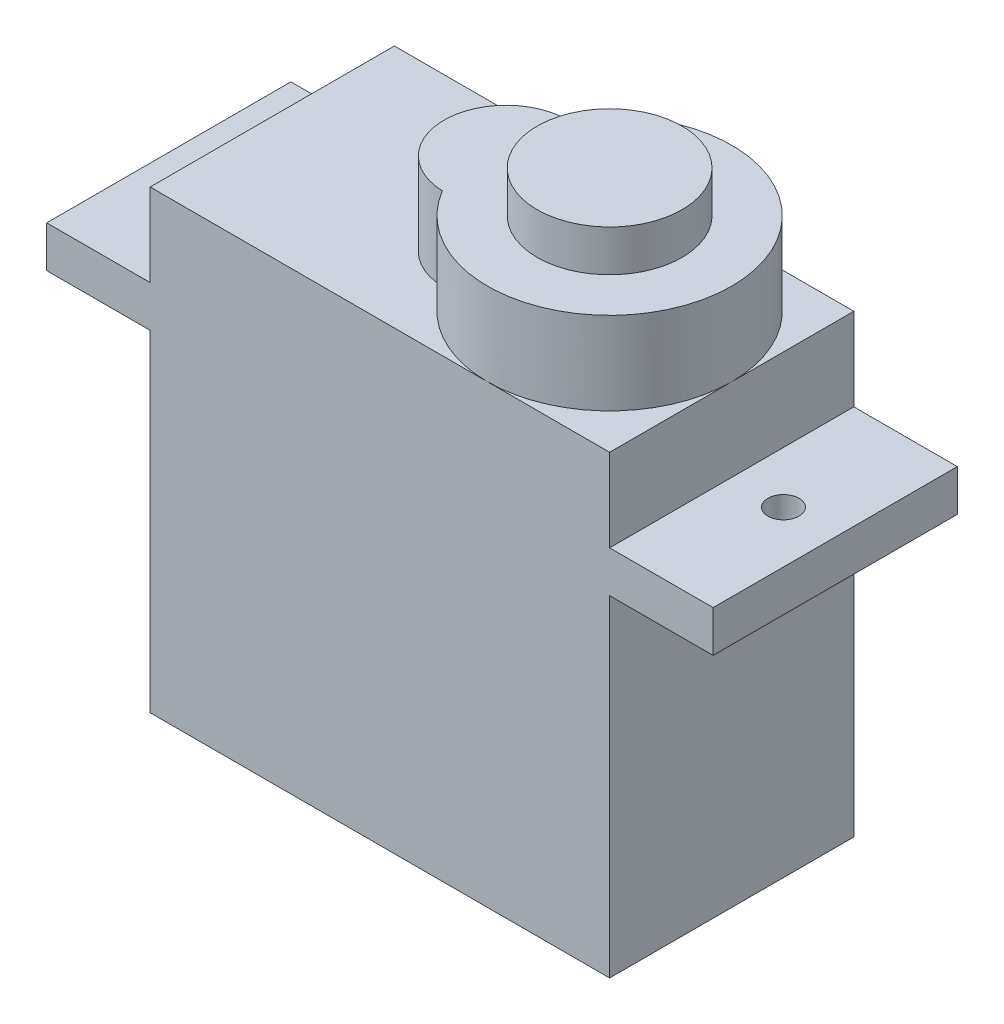
ISO-10303-21;
HEADER;
FILE_DESCRIPTION(('STEP AP214'),'2;1');
FILE_NAME('part.step','',(''),(''),'','','');
FILE_SCHEMA(('AUTOMOTIVE_DESIGN { 1 0 10303 214 1 1 1 1 }'));
ENDSEC;
DATA;
#1=APPLICATION_CONTEXT('core data for automotive mechanical design processes');
#2=APPLICATION_PROTOCOL_DEFINITION('international standard','automotive_design',2000,#1);
#3=PRODUCT_CONTEXT('',#1,'mechanical');
#4=PRODUCT('Part','Part','',(#3));
#5=PRODUCT_RELATED_PRODUCT_CATEGORY('part','',(#4));
#6=PRODUCT_DEFINITION_FORMATION('','',#4);
#7=PRODUCT_DEFINITION_CONTEXT('part definition',#1,'design');
#8=PRODUCT_DEFINITION('design','',#6,#7);
#9=PRODUCT_DEFINITION_SHAPE('','',#8);
#10=(LENGTH_UNIT() NAMED_UNIT(*) SI_UNIT(.MILLI.,.METRE.));
#11=(NAMED_UNIT(*) PLANE_ANGLE_UNIT() SI_UNIT($,.RADIAN.));
#12=(NAMED_UNIT(*) SI_UNIT($,.STERADIAN.) SOLID_ANGLE_UNIT());
#13=UNCERTAINTY_MEASURE_WITH_UNIT(LENGTH_MEASURE(1.E-05),#10,'distance_accuracy_value','');
#14=(GEOMETRIC_REPRESENTATION_CONTEXT(3) GLOBAL_UNCERTAINTY_ASSIGNED_CONTEXT((#13)) GLOBAL_UNIT_ASSIGNED_CONTEXT((#10,
#11,#12)) REPRESENTATION_CONTEXT('',''));
#15=CARTESIAN_POINT('',(0.,0.,0.));
#16=DIRECTION('',(0.,0.,1.));
#17=DIRECTION('',(1.,0.,0.));
#18=AXIS2_PLACEMENT_3D('',#15,#16,#17);
#19=CARTESIAN_POINT('',(0.,0.,0.));
#20=DIRECTION('',(0.,-1.,0.));
#21=DIRECTION('',(0.,0.,-1.));
#22=AXIS2_PLACEMENT_3D('',#19,#20,#21);
#23=PLANE('',#22);
#24=CARTESIAN_POINT('',(5.2,0.,0.));
#25=DIRECTION('',(0.,1.,0.));
#26=DIRECTION('',(0.,0.,1.));
#27=AXIS2_PLACEMENT_3D('',#24,#25,#26);
#28=CIRCLE('',#27,5.9);
#29=CARTESIAN_POINT('',(0.119,0.,2.99890630063695));
#30=VERTEX_POINT('',#29);
#31=CARTESIAN_POINT('',(5.2,0.,5.9));
#32=VERTEX_POINT('',#31);
#33=EDGE_CURVE('E275',#30,#32,#28,.T.);
#34=ORIENTED_EDGE('',*,*,#33,.F.);
#35=CARTESIAN_POINT('',(0.200000000000001,0.,0.));
#36=DIRECTION('',(0.,1.,0.));
#37=DIRECTION('',(0.,0.,1.));
#38=AXIS2_PLACEMENT_3D('',#35,#36,#37);
#39=CIRCLE('',#38,3.);
#40=CARTESIAN_POINT('',(0.119000000000001,0.,-2.99890630063695));
#41=VERTEX_POINT('',#40);
#42=EDGE_CURVE('E50',#41,#30,#39,.T.);
#43=ORIENTED_EDGE('',*,*,#42,.F.);
#44=CARTESIAN_POINT('',(5.2,0.,-5.9));
#45=VERTEX_POINT('',#44);
#46=EDGE_CURVE('E162',#45,#41,#28,.T.);
#47=ORIENTED_EDGE('',*,*,#46,.F.);
#48=DIRECTION('',(-1.,0.,0.));
#49=VECTOR('',#48,1.);
#50=CARTESIAN_POINT('',(11.1,0.,-5.9));
#51=LINE('',#50,#49);
#52=CARTESIAN_POINT('',(-11.1,0.,-5.9));
#53=VERTEX_POINT('',#52);
#54=EDGE_CURVE('E214',#45,#53,#51,.T.);
#55=ORIENTED_EDGE('',*,*,#54,.T.);
#56=DIRECTION('',(0.,0.,-1.));
#57=VECTOR('',#56,1.);
#58=CARTESIAN_POINT('',(-11.1,0.,5.9));
#59=LINE('',#58,#57);
#60=CARTESIAN_POINT('',(-11.1,0.,5.9));
#61=VERTEX_POINT('',#60);
#62=EDGE_CURVE('E234',#61,#53,#59,.T.);
#63=ORIENTED_EDGE('',*,*,#62,.F.);
#64=DIRECTION('',(-1.,0.,0.));
#65=VECTOR('',#64,1.);
#66=CARTESIAN_POINT('',(11.1,0.,5.9));
#67=LINE('',#66,#65);
#68=EDGE_CURVE('E237',#32,#61,#67,.T.);
#69=ORIENTED_EDGE('',*,*,#68,.F.);
#70=EDGE_LOOP('',(#34,#43,#47,#55,#63,#69));
#71=FACE_BOUND('',#70,.T.);
#72=ADVANCED_FACE('F33',(#71),#23,.F.);
#73=CARTESIAN_POINT('',(11.1,0.,0.));
#74=VERTEX_POINT('',#73);
#75=EDGE_CURVE('E42',#32,#74,#28,.T.);
#76=ORIENTED_EDGE('',*,*,#75,.F.);
#77=CARTESIAN_POINT('',(11.1,0.,5.9));
#78=VERTEX_POINT('',#77);
#79=EDGE_CURVE('E238',#78,#32,#67,.T.);
#80=ORIENTED_EDGE('',*,*,#79,.F.);
#81=DIRECTION('',(0.,0.,-1.));
#82=VECTOR('',#81,1.);
#83=CARTESIAN_POINT('',(11.1,0.,5.9));
#84=LINE('',#83,#82);
#85=EDGE_CURVE('E224',#78,#74,#84,.T.);
#86=ORIENTED_EDGE('',*,*,#85,.T.);
#87=EDGE_LOOP('',(#76,#80,#86));
#88=FACE_BOUND('',#87,.T.);
#89=ADVANCED_FACE('F283',(#88),#23,.F.);
#90=CARTESIAN_POINT('',(-11.1,-22.,5.9));
#91=DIRECTION('',(1.,0.,0.));
#92=DIRECTION('',(0.,0.,-1.));
#93=AXIS2_PLACEMENT_3D('',#90,#91,#92);
#94=PLANE('',#93);
#95=DIRECTION('',(0.,0.,1.));
#96=VECTOR('',#95,1.);
#97=CARTESIAN_POINT('',(-11.1,-5.99999999999999,-5.9));
#98=LINE('',#97,#96);
#99=CARTESIAN_POINT('',(-11.1,-5.99999999999999,-5.9));
#100=VERTEX_POINT('',#99);
#101=CARTESIAN_POINT('',(-11.1,-5.99999999999999,5.9));
#102=VERTEX_POINT('',#101);
#103=EDGE_CURVE('E179',#100,#102,#98,.T.);
#104=ORIENTED_EDGE('',*,*,#103,.F.);
#105=DIRECTION('',(0.,1.,0.));
#106=VECTOR('',#105,1.);
#107=CARTESIAN_POINT('',(-11.1,-22.,-5.9));
#108=LINE('',#107,#106);
#109=CARTESIAN_POINT('',(-11.1,-22.,-5.9));
#110=VERTEX_POINT('',#109);
#111=EDGE_CURVE('E37',#110,#100,#108,.T.);
#112=ORIENTED_EDGE('',*,*,#111,.F.);
#113=DIRECTION('',(0.,0.,-1.));
#114=VECTOR('',#113,1.);
#115=CARTESIAN_POINT('',(-11.1,-22.,5.9));
#116=LINE('',#115,#114);
#117=CARTESIAN_POINT('',(-11.1,-22.,5.9));
#118=VERTEX_POINT('',#117);
#119=EDGE_CURVE('E223',#118,#110,#116,.T.);
#120=ORIENTED_EDGE('',*,*,#119,.F.);
#121=DIRECTION('',(0.,1.,0.));
#122=VECTOR('',#121,1.);
#123=CARTESIAN_POINT('',(-11.1,-22.,5.9));
#124=LINE('',#123,#122);
#125=EDGE_CURVE('E251',#118,#102,#124,.T.);
#126=ORIENTED_EDGE('',*,*,#125,.T.);
#127=EDGE_LOOP('',(#104,#112,#120,#126));
#128=FACE_BOUND('',#127,.T.);
#129=ADVANCED_FACE('F309',(#128),#94,.F.);
#130=CARTESIAN_POINT('',(11.1,-22.,5.9));
#131=DIRECTION('',(1.,0.,0.));
#132=DIRECTION('',(0.,0.,-1.));
#133=AXIS2_PLACEMENT_3D('',#130,#131,#132);
#134=PLANE('',#133);
#135=DIRECTION('',(0.,1.,0.));
#136=VECTOR('',#135,1.);
#137=CARTESIAN_POINT('',(11.1,-22.,-5.9));
#138=LINE('',#137,#136);
#139=CARTESIAN_POINT('',(11.1,-22.,-5.9));
#140=VERTEX_POINT('',#139);
#141=CARTESIAN_POINT('',(11.1,-5.99999999999999,-5.9));
#142=VERTEX_POINT('',#141);
#143=EDGE_CURVE('E244',#140,#142,#138,.T.);
#144=ORIENTED_EDGE('',*,*,#143,.T.);
#145=DIRECTION('',(0.,0.,1.));
#146=VECTOR('',#145,1.);
#147=CARTESIAN_POINT('',(11.1,-5.99999999999999,-5.9));
#148=LINE('',#147,#146);
#149=CARTESIAN_POINT('',(11.1,-5.99999999999999,5.9));
#150=VERTEX_POINT('',#149);
#151=EDGE_CURVE('E211',#142,#150,#148,.T.);
#152=ORIENTED_EDGE('',*,*,#151,.T.);
#153=DIRECTION('',(0.,1.,0.));
#154=VECTOR('',#153,1.);
#155=CARTESIAN_POINT('',(11.1,-22.,5.9));
#156=LINE('',#155,#154);
#157=CARTESIAN_POINT('',(11.1,-22.,5.9));
#158=VERTEX_POINT('',#157);
#159=EDGE_CURVE('E248',#158,#150,#156,.T.);
#160=ORIENTED_EDGE('',*,*,#159,.F.);
#161=DIRECTION('',(0.,0.,-1.));
#162=VECTOR('',#161,1.);
#163=CARTESIAN_POINT('',(11.1,-22.,5.9));
#164=LINE('',#163,#162);
#165=EDGE_CURVE('E228',#158,#140,#164,.T.);
#166=ORIENTED_EDGE('',*,*,#165,.T.);
#167=EDGE_LOOP('',(#144,#152,#160,#166));
#168=FACE_BOUND('',#167,.T.);
#169=ADVANCED_FACE('F304',(#168),#134,.T.);
#170=CARTESIAN_POINT('',(11.1,-22.,-5.9));
#171=DIRECTION('',(0.,0.,-1.));
#172=DIRECTION('',(-1.,0.,0.));
#173=AXIS2_PLACEMENT_3D('',#170,#171,#172);
#174=PLANE('',#173);
#175=CARTESIAN_POINT('',(11.1,0.,-5.9));
#176=VERTEX_POINT('',#175);
#177=EDGE_CURVE('E232',#176,#45,#51,.T.);
#178=ORIENTED_EDGE('',*,*,#177,.F.);
#179=CARTESIAN_POINT('',(11.1,-3.99999999999999,-5.9));
#180=VERTEX_POINT('',#179);
#181=EDGE_CURVE('E247',#180,#176,#138,.T.);
#182=ORIENTED_EDGE('',*,*,#181,.F.);
#183=DIRECTION('',(-1.,0.,0.));
#184=VECTOR('',#183,1.);
#185=CARTESIAN_POINT('',(11.1,-3.99999999999999,-5.9));
#186=LINE('',#185,#184);
#187=CARTESIAN_POINT('',(16.1,-3.99999999999999,-5.9));
#188=VERTEX_POINT('',#187);
#189=EDGE_CURVE('E201',#188,#180,#186,.T.);
#190=ORIENTED_EDGE('',*,*,#189,.F.);
#191=DIRECTION('',(0.,1.,0.));
#192=VECTOR('',#191,1.);
#193=CARTESIAN_POINT('',(16.1,-5.99999999999999,-5.9));
#194=LINE('',#193,#192);
#195=CARTESIAN_POINT('',(16.1,-5.99999999999999,-5.9));
#196=VERTEX_POINT('',#195);
#197=EDGE_CURVE('E197',#196,#188,#194,.T.);
#198=ORIENTED_EDGE('',*,*,#197,.F.);
#199=DIRECTION('',(1.,0.,0.));
#200=VECTOR('',#199,1.);
#201=CARTESIAN_POINT('',(11.1,-5.99999999999999,-5.9));
#202=LINE('',#201,#200);
#203=EDGE_CURVE('E194',#142,#196,#202,.T.);
#204=ORIENTED_EDGE('',*,*,#203,.F.);
#205=ORIENTED_EDGE('',*,*,#143,.F.);
#206=DIRECTION('',(-1.,0.,0.));
#207=VECTOR('',#206,1.);
#208=CARTESIAN_POINT('',(11.1,-22.,-5.9));
#209=LINE('',#208,#207);
#210=EDGE_CURVE('E220',#140,#110,#209,.T.);
#211=ORIENTED_EDGE('',*,*,#210,.T.);
#212=ORIENTED_EDGE('',*,*,#111,.T.);
#213=DIRECTION('',(1.,0.,0.));
#214=VECTOR('',#213,1.);
#215=CARTESIAN_POINT('',(-11.1,-5.99999999999999,-5.9));
#216=LINE('',#215,#214);
#217=CARTESIAN_POINT('',(-16.1,-5.99999999999999,-5.9));
#218=VERTEX_POINT('',#217);
#219=EDGE_CURVE('E171',#218,#100,#216,.T.);
#220=ORIENTED_EDGE('',*,*,#219,.F.);
#221=DIRECTION('',(0.,-1.,0.));
#222=VECTOR('',#221,1.);
#223=CARTESIAN_POINT('',(-16.1,-5.99999999999999,-5.9));
#224=LINE('',#223,#222);
#225=CARTESIAN_POINT('',(-16.1,-3.99999999999999,-5.9));
#226=VERTEX_POINT('',#225);
#227=EDGE_CURVE('E177',#226,#218,#224,.T.);
#228=ORIENTED_EDGE('',*,*,#227,.F.);
#229=DIRECTION('',(-1.,0.,0.));
#230=VECTOR('',#229,1.);
#231=CARTESIAN_POINT('',(-11.1,-3.99999999999999,-5.9));
#232=LINE('',#231,#230);
#233=CARTESIAN_POINT('',(-11.1,-3.99999999999999,-5.9));
#234=VERTEX_POINT('',#233);
#235=EDGE_CURVE('E173',#234,#226,#232,.T.);
#236=ORIENTED_EDGE('',*,*,#235,.F.);
#237=EDGE_CURVE('E231',#234,#53,#108,.T.);
#238=ORIENTED_EDGE('',*,*,#237,.T.);
#239=ORIENTED_EDGE('',*,*,#54,.F.);
#240=EDGE_LOOP('',(#178,#182,#190,#198,#204,#205,#211,#212,#220,#228,#236,#238,#239));
#241=FACE_BOUND('',#240,.T.);
#242=ADVANCED_FACE('F35',(#241),#174,.T.);
#243=DIRECTION('',(0.,0.,1.));
#244=VECTOR('',#243,1.);
#245=CARTESIAN_POINT('',(11.1,-3.99999999999999,-5.9));
#246=LINE('',#245,#244);
#247=CARTESIAN_POINT('',(11.1,-3.99999999999999,5.9));
#248=VERTEX_POINT('',#247);
#249=EDGE_CURVE('E215',#180,#248,#246,.T.);
#250=ORIENTED_EDGE('',*,*,#249,.F.);
#251=ORIENTED_EDGE('',*,*,#181,.T.);
#252=EDGE_CURVE('E241',#74,#176,#84,.T.);
#253=ORIENTED_EDGE('',*,*,#252,.F.);
#254=ORIENTED_EDGE('',*,*,#85,.F.);
#255=EDGE_CURVE('E250',#248,#78,#156,.T.);
#256=ORIENTED_EDGE('',*,*,#255,.F.);
#257=EDGE_LOOP('',(#250,#251,#253,#254,#256));
#258=FACE_BOUND('',#257,.T.);
#259=ADVANCED_FACE('F288',(#258),#134,.T.);
#260=CARTESIAN_POINT('',(11.1,-22.,5.9));
#261=DIRECTION('',(0.,0.,-1.));
#262=DIRECTION('',(-1.,0.,0.));
#263=AXIS2_PLACEMENT_3D('',#260,#261,#262);
#264=PLANE('',#263);
#265=ORIENTED_EDGE('',*,*,#79,.T.);
#266=ORIENTED_EDGE('',*,*,#68,.T.);
#267=CARTESIAN_POINT('',(-11.1,-3.99999999999999,5.9));
#268=VERTEX_POINT('',#267);
#269=EDGE_CURVE('E253',#268,#61,#124,.T.);
#270=ORIENTED_EDGE('',*,*,#269,.F.);
#271=DIRECTION('',(-1.,0.,0.));
#272=VECTOR('',#271,1.);
#273=CARTESIAN_POINT('',(-11.1,-3.99999999999999,5.9));
#274=LINE('',#273,#272);
#275=CARTESIAN_POINT('',(-16.1,-3.99999999999999,5.9));
#276=VERTEX_POINT('',#275);
#277=EDGE_CURVE('E166',#268,#276,#274,.T.);
#278=ORIENTED_EDGE('',*,*,#277,.T.);
#279=DIRECTION('',(0.,-1.,0.));
#280=VECTOR('',#279,1.);
#281=CARTESIAN_POINT('',(-16.1,-5.99999999999999,5.9));
#282=LINE('',#281,#280);
#283=CARTESIAN_POINT('',(-16.1,-5.99999999999999,5.9));
#284=VERTEX_POINT('',#283);
#285=EDGE_CURVE('E174',#276,#284,#282,.T.);
#286=ORIENTED_EDGE('',*,*,#285,.T.);
#287=DIRECTION('',(1.,0.,0.));
#288=VECTOR('',#287,1.);
#289=CARTESIAN_POINT('',(-11.1,-5.99999999999999,5.9));
#290=LINE('',#289,#288);
#291=EDGE_CURVE('E163',#284,#102,#290,.T.);
#292=ORIENTED_EDGE('',*,*,#291,.T.);
#293=ORIENTED_EDGE('',*,*,#125,.F.);
#294=DIRECTION('',(-1.,0.,0.));
#295=VECTOR('',#294,1.);
#296=CARTESIAN_POINT('',(11.1,-22.,5.9));
#297=LINE('',#296,#295);
#298=EDGE_CURVE('E226',#158,#118,#297,.T.);
#299=ORIENTED_EDGE('',*,*,#298,.F.);
#300=ORIENTED_EDGE('',*,*,#159,.T.);
#301=DIRECTION('',(1.,0.,0.));
#302=VECTOR('',#301,1.);
#303=CARTESIAN_POINT('',(11.1,-5.99999999999999,5.9));
#304=LINE('',#303,#302);
#305=CARTESIAN_POINT('',(16.1,-5.99999999999999,5.9));
#306=VERTEX_POINT('',#305);
#307=EDGE_CURVE('E187',#150,#306,#304,.T.);
#308=ORIENTED_EDGE('',*,*,#307,.T.);
#309=DIRECTION('',(0.,1.,0.));
#310=VECTOR('',#309,1.);
#311=CARTESIAN_POINT('',(16.1,-5.99999999999999,5.9));
#312=LINE('',#311,#310);
#313=CARTESIAN_POINT('',(16.1,-3.99999999999999,5.9));
#314=VERTEX_POINT('',#313);
#315=EDGE_CURVE('E206',#306,#314,#312,.T.);
#316=ORIENTED_EDGE('',*,*,#315,.T.);
#317=DIRECTION('',(-1.,0.,0.));
#318=VECTOR('',#317,1.);
#319=CARTESIAN_POINT('',(11.1,-3.99999999999999,5.9));
#320=LINE('',#319,#318);
#321=EDGE_CURVE('E198',#314,#248,#320,.T.);
#322=ORIENTED_EDGE('',*,*,#321,.T.);
#323=ORIENTED_EDGE('',*,*,#255,.T.);
#324=EDGE_LOOP('',(#265,#266,#270,#278,#286,#292,#293,#299,#300,#308,#316,#322,#323));
#325=FACE_BOUND('',#324,.T.);
#326=ADVANCED_FACE('F314',(#325),#264,.F.);
#327=ORIENTED_EDGE('',*,*,#237,.F.);
#328=DIRECTION('',(0.,0.,1.));
#329=VECTOR('',#328,1.);
#330=CARTESIAN_POINT('',(-11.1,-3.99999999999999,-5.9));
#331=LINE('',#330,#329);
#332=EDGE_CURVE('E190',#234,#268,#331,.T.);
#333=ORIENTED_EDGE('',*,*,#332,.T.);
#334=ORIENTED_EDGE('',*,*,#269,.T.);
#335=ORIENTED_EDGE('',*,*,#62,.T.);
#336=EDGE_LOOP('',(#327,#333,#334,#335));
#337=FACE_BOUND('',#336,.T.);
#338=ADVANCED_FACE('F272',(#337),#94,.F.);
#339=CARTESIAN_POINT('',(0.,-22.,0.));
#340=DIRECTION('',(0.,-1.,0.));
#341=DIRECTION('',(0.,0.,-1.));
#342=AXIS2_PLACEMENT_3D('',#339,#340,#341);
#343=PLANE('',#342);
#344=ORIENTED_EDGE('',*,*,#210,.F.);
#345=ORIENTED_EDGE('',*,*,#165,.F.);
#346=ORIENTED_EDGE('',*,*,#298,.T.);
#347=ORIENTED_EDGE('',*,*,#119,.T.);
#348=EDGE_LOOP('',(#344,#345,#346,#347));
#349=FACE_BOUND('',#348,.T.);
#350=ADVANCED_FACE('F308',(#349),#343,.T.);
#351=EDGE_CURVE('E58',#74,#45,#28,.T.);
#352=ORIENTED_EDGE('',*,*,#351,.F.);
#353=ORIENTED_EDGE('',*,*,#252,.T.);
#354=ORIENTED_EDGE('',*,*,#177,.T.);
#355=EDGE_LOOP('',(#352,#353,#354));
#356=FACE_BOUND('',#355,.T.);
#357=ADVANCED_FACE('F291',(#356),#23,.F.);
#358=CARTESIAN_POINT('',(11.1,-5.99999999999999,-5.9));
#359=DIRECTION('',(0.,-1.,0.));
#360=DIRECTION('',(1.,0.,0.));
#361=AXIS2_PLACEMENT_3D('',#358,#359,#360);
#362=PLANE('',#361);
#363=CARTESIAN_POINT('',(13.6,-5.99999999999999,0.));
#364=DIRECTION('',(0.,1.,0.));
#365=DIRECTION('',(0.,0.,1.));
#366=AXIS2_PLACEMENT_3D('',#363,#364,#365);
#367=CIRCLE('',#366,0.75);
#368=CARTESIAN_POINT('',(13.6,-5.99999999999999,0.750000000000001));
#369=VERTEX_POINT('',#368);
#370=EDGE_CURVE('E528',#369,#369,#367,.T.);
#371=ORIENTED_EDGE('',*,*,#370,.T.);
#372=EDGE_LOOP('',(#371));
#373=FACE_BOUND('',#372,.T.);
#374=ORIENTED_EDGE('',*,*,#307,.F.);
#375=ORIENTED_EDGE('',*,*,#151,.F.);
#376=ORIENTED_EDGE('',*,*,#203,.T.);
#377=DIRECTION('',(0.,0.,1.));
#378=VECTOR('',#377,1.);
#379=CARTESIAN_POINT('',(16.1,-5.99999999999999,-5.9));
#380=LINE('',#379,#378);
#381=EDGE_CURVE('E203',#196,#306,#380,.T.);
#382=ORIENTED_EDGE('',*,*,#381,.T.);
#383=EDGE_LOOP('',(#374,#375,#376,#382));
#384=FACE_BOUND('',#383,.T.);
#385=ADVANCED_FACE('F301',(#373,#384),#362,.T.);
#386=CARTESIAN_POINT('',(11.1,-3.99999999999999,-5.9));
#387=DIRECTION('',(0.,1.,0.));
#388=DIRECTION('',(0.,0.,1.));
#389=AXIS2_PLACEMENT_3D('',#386,#387,#388);
#390=PLANE('',#389);
#391=CARTESIAN_POINT('',(13.6,-3.99999999999999,0.));
#392=DIRECTION('',(0.,1.,0.));
#393=DIRECTION('',(0.,0.,1.));
#394=AXIS2_PLACEMENT_3D('',#391,#392,#393);
#395=CIRCLE('',#394,0.75);
#396=CARTESIAN_POINT('',(13.6,-3.99999999999999,0.750000000000001));
#397=VERTEX_POINT('',#396);
#398=EDGE_CURVE('E530',#397,#397,#395,.T.);
#399=ORIENTED_EDGE('',*,*,#398,.F.);
#400=EDGE_LOOP('',(#399));
#401=FACE_BOUND('',#400,.T.);
#402=ORIENTED_EDGE('',*,*,#321,.F.);
#403=DIRECTION('',(0.,0.,1.));
#404=VECTOR('',#403,1.);
#405=CARTESIAN_POINT('',(16.1,-3.99999999999999,-5.9));
#406=LINE('',#405,#404);
#407=EDGE_CURVE('E217',#188,#314,#406,.T.);
#408=ORIENTED_EDGE('',*,*,#407,.F.);
#409=ORIENTED_EDGE('',*,*,#189,.T.);
#410=ORIENTED_EDGE('',*,*,#249,.T.);
#411=EDGE_LOOP('',(#402,#408,#409,#410));
#412=FACE_BOUND('',#411,.T.);
#413=ADVANCED_FACE('F320',(#401,#412),#390,.T.);
#414=CARTESIAN_POINT('',(16.1,-5.99999999999999,-5.9));
#415=DIRECTION('',(1.,0.,0.));
#416=DIRECTION('',(0.,0.,-1.));
#417=AXIS2_PLACEMENT_3D('',#414,#415,#416);
#418=PLANE('',#417);
#419=ORIENTED_EDGE('',*,*,#315,.F.);
#420=ORIENTED_EDGE('',*,*,#381,.F.);
#421=ORIENTED_EDGE('',*,*,#197,.T.);
#422=ORIENTED_EDGE('',*,*,#407,.T.);
#423=EDGE_LOOP('',(#419,#420,#421,#422));
#424=FACE_BOUND('',#423,.T.);
#425=ADVANCED_FACE('F298',(#424),#418,.T.);
#426=CARTESIAN_POINT('',(-11.1,-5.99999999999999,-5.9));
#427=DIRECTION('',(0.,-1.,0.));
#428=DIRECTION('',(1.,0.,0.));
#429=AXIS2_PLACEMENT_3D('',#426,#427,#428);
#430=PLANE('',#429);
#431=CARTESIAN_POINT('',(-13.6,-5.99999999999999,0.));
#432=DIRECTION('',(0.,1.,0.));
#433=DIRECTION('',(0.,0.,1.));
#434=AXIS2_PLACEMENT_3D('',#431,#432,#433);
#435=CIRCLE('',#434,0.75);
#436=CARTESIAN_POINT('',(-13.6,-5.99999999999999,0.750000000000001));
#437=VERTEX_POINT('',#436);
#438=EDGE_CURVE('E279',#437,#437,#435,.F.);
#439=ORIENTED_EDGE('',*,*,#438,.F.);
#440=EDGE_LOOP('',(#439));
#441=FACE_BOUND('',#440,.T.);
#442=ORIENTED_EDGE('',*,*,#291,.F.);
#443=DIRECTION('',(0.,0.,1.));
#444=VECTOR('',#443,1.);
#445=CARTESIAN_POINT('',(-16.1,-5.99999999999999,-5.9));
#446=LINE('',#445,#444);
#447=EDGE_CURVE('E185',#218,#284,#446,.T.);
#448=ORIENTED_EDGE('',*,*,#447,.F.);
#449=ORIENTED_EDGE('',*,*,#219,.T.);
#450=ORIENTED_EDGE('',*,*,#103,.T.);
#451=EDGE_LOOP('',(#442,#448,#449,#450));
#452=FACE_BOUND('',#451,.T.);
#453=ADVANCED_FACE('F312',(#441,#452),#430,.T.);
#454=CARTESIAN_POINT('',(-16.1,-5.99999999999999,-5.9));
#455=DIRECTION('',(-1.,0.,0.));
#456=DIRECTION('',(0.,0.,1.));
#457=AXIS2_PLACEMENT_3D('',#454,#455,#456);
#458=PLANE('',#457);
#459=ORIENTED_EDGE('',*,*,#285,.F.);
#460=DIRECTION('',(0.,0.,1.));
#461=VECTOR('',#460,1.);
#462=CARTESIAN_POINT('',(-16.1,-3.99999999999999,-5.9));
#463=LINE('',#462,#461);
#464=EDGE_CURVE('E188',#226,#276,#463,.T.);
#465=ORIENTED_EDGE('',*,*,#464,.F.);
#466=ORIENTED_EDGE('',*,*,#227,.T.);
#467=ORIENTED_EDGE('',*,*,#447,.T.);
#468=EDGE_LOOP('',(#459,#465,#466,#467));
#469=FACE_BOUND('',#468,.T.);
#470=ADVANCED_FACE('F317',(#469),#458,.T.);
#471=CARTESIAN_POINT('',(-11.1,-3.99999999999999,-5.9));
#472=DIRECTION('',(0.,1.,0.));
#473=DIRECTION('',(-1.,0.,0.));
#474=AXIS2_PLACEMENT_3D('',#471,#472,#473);
#475=PLANE('',#474);
#476=CARTESIAN_POINT('',(-13.6,-3.99999999999999,0.));
#477=DIRECTION('',(0.,1.,0.));
#478=DIRECTION('',(0.,0.,1.));
#479=AXIS2_PLACEMENT_3D('',#476,#477,#478);
#480=CIRCLE('',#479,0.75);
#481=CARTESIAN_POINT('',(-13.6,-3.99999999999999,0.750000000000001));
#482=VERTEX_POINT('',#481);
#483=EDGE_CURVE('E531',#482,#482,#480,.F.);
#484=ORIENTED_EDGE('',*,*,#483,.T.);
#485=EDGE_LOOP('',(#484));
#486=FACE_BOUND('',#485,.T.);
#487=ORIENTED_EDGE('',*,*,#277,.F.);
#488=ORIENTED_EDGE('',*,*,#332,.F.);
#489=ORIENTED_EDGE('',*,*,#235,.T.);
#490=ORIENTED_EDGE('',*,*,#464,.T.);
#491=EDGE_LOOP('',(#487,#488,#489,#490));
#492=FACE_BOUND('',#491,.T.);
#493=ADVANCED_FACE('F319',(#486,#492),#475,.T.);
#494=CARTESIAN_POINT('',(5.2,4.,0.));
#495=DIRECTION('',(0.,-1.,0.));
#496=DIRECTION('',(0.,0.,-1.));
#497=AXIS2_PLACEMENT_3D('',#494,#495,#496);
#498=CYLINDRICAL_SURFACE('',#497,5.9);
#499=ORIENTED_EDGE('',*,*,#33,.T.);
#500=ORIENTED_EDGE('',*,*,#75,.T.);
#501=ORIENTED_EDGE('',*,*,#351,.T.);
#502=ORIENTED_EDGE('',*,*,#46,.T.);
#503=DIRECTION('',(0.,-1.,0.));
#504=VECTOR('',#503,1.);
#505=CARTESIAN_POINT('',(0.119000000000001,4.,-2.99890630063695));
#506=LINE('',#505,#504);
#507=CARTESIAN_POINT('',(0.119000000000001,4.,-2.99890630063695));
#508=VERTEX_POINT('',#507);
#509=EDGE_CURVE('E150',#508,#41,#506,.T.);
#510=ORIENTED_EDGE('',*,*,#509,.F.);
#511=CARTESIAN_POINT('',(5.2,4.,0.));
#512=DIRECTION('',(0.,1.,0.));
#513=DIRECTION('',(0.,0.,1.));
#514=AXIS2_PLACEMENT_3D('',#511,#512,#513);
#515=CIRCLE('',#514,5.9);
#516=CARTESIAN_POINT('',(0.119,4.,2.99890630063695));
#517=VERTEX_POINT('',#516);
#518=EDGE_CURVE('E155',#517,#508,#515,.T.);
#519=ORIENTED_EDGE('',*,*,#518,.F.);
#520=DIRECTION('',(0.,-1.,0.));
#521=VECTOR('',#520,1.);
#522=CARTESIAN_POINT('',(0.119,4.,2.99890630063695));
#523=LINE('',#522,#521);
#524=EDGE_CURVE('E152',#517,#30,#523,.T.);
#525=ORIENTED_EDGE('',*,*,#524,.T.);
#526=EDGE_LOOP('',(#499,#500,#501,#502,#510,#519,#525));
#527=FACE_BOUND('',#526,.T.);
#528=ADVANCED_FACE('F161',(#527),#498,.T.);
#529=CARTESIAN_POINT('',(0.200000000000001,4.,0.));
#530=DIRECTION('',(0.,-1.,0.));
#531=DIRECTION('',(0.,0.,-1.));
#532=AXIS2_PLACEMENT_3D('',#529,#530,#531);
#533=CYLINDRICAL_SURFACE('',#532,3.);
#534=ORIENTED_EDGE('',*,*,#42,.T.);
#535=ORIENTED_EDGE('',*,*,#524,.F.);
#536=CARTESIAN_POINT('',(0.200000000000001,4.,0.));
#537=DIRECTION('',(0.,1.,0.));
#538=DIRECTION('',(0.,0.,1.));
#539=AXIS2_PLACEMENT_3D('',#536,#537,#538);
#540=CIRCLE('',#539,3.);
#541=EDGE_CURVE('E146',#508,#517,#540,.T.);
#542=ORIENTED_EDGE('',*,*,#541,.F.);
#543=ORIENTED_EDGE('',*,*,#509,.T.);
#544=EDGE_LOOP('',(#534,#535,#542,#543));
#545=FACE_BOUND('',#544,.T.);
#546=ADVANCED_FACE('F148',(#545),#533,.T.);
#547=CARTESIAN_POINT('',(2.7,4.,0.));
#548=DIRECTION('',(0.,1.,0.));
#549=DIRECTION('',(0.,0.,1.));
#550=AXIS2_PLACEMENT_3D('',#547,#548,#549);
#551=PLANE('',#550);
#552=CARTESIAN_POINT('',(5.2,4.,0.));
#553=DIRECTION('',(0.,1.,0.));
#554=DIRECTION('',(0.,0.,1.));
#555=AXIS2_PLACEMENT_3D('',#552,#553,#554);
#556=CIRCLE('',#555,3.5);
#557=CARTESIAN_POINT('',(5.2,4.,3.5));
#558=VERTEX_POINT('',#557);
#559=EDGE_CURVE('E11',#558,#558,#556,.T.);
#560=ORIENTED_EDGE('',*,*,#559,.F.);
#561=EDGE_LOOP('',(#560));
#562=FACE_BOUND('',#561,.T.);
#563=ORIENTED_EDGE('',*,*,#518,.T.);
#564=ORIENTED_EDGE('',*,*,#541,.T.);
#565=EDGE_LOOP('',(#563,#564));
#566=FACE_BOUND('',#565,.T.);
#567=ADVANCED_FACE('F157',(#562,#566),#551,.T.);
#568=CARTESIAN_POINT('',(5.2,6.,0.));
#569=DIRECTION('',(0.,-1.,0.));
#570=DIRECTION('',(0.,0.,-1.));
#571=AXIS2_PLACEMENT_3D('',#568,#569,#570);
#572=CYLINDRICAL_SURFACE('',#571,3.5);
#573=CARTESIAN_POINT('',(5.2,6.,0.));
#574=DIRECTION('',(0.,1.,0.));
#575=DIRECTION('',(0.,0.,1.));
#576=AXIS2_PLACEMENT_3D('',#573,#574,#575);
#577=CIRCLE('',#576,3.5);
#578=CARTESIAN_POINT('',(5.2,6.,3.5));
#579=VERTEX_POINT('',#578);
#580=EDGE_CURVE('E276',#579,#579,#577,.T.);
#581=ORIENTED_EDGE('',*,*,#580,.F.);
#582=EDGE_LOOP('',(#581));
#583=FACE_BOUND('',#582,.T.);
#584=ORIENTED_EDGE('',*,*,#559,.T.);
#585=EDGE_LOOP('',(#584));
#586=FACE_BOUND('',#585,.T.);
#587=ADVANCED_FACE('F402',(#583,#586),#572,.T.);
#588=CARTESIAN_POINT('',(5.2,6.,0.));
#589=DIRECTION('',(0.,1.,0.));
#590=DIRECTION('',(0.,0.,1.));
#591=AXIS2_PLACEMENT_3D('',#588,#589,#590);
#592=PLANE('',#591);
#593=ORIENTED_EDGE('',*,*,#580,.T.);
#594=EDGE_LOOP('',(#593));
#595=FACE_BOUND('',#594,.T.);
#596=ADVANCED_FACE('F412',(#595),#592,.T.);
#597=CARTESIAN_POINT('',(-13.6,-5.99999999999999,0.));
#598=DIRECTION('',(0.,1.,0.));
#599=DIRECTION('',(0.,0.,1.));
#600=AXIS2_PLACEMENT_3D('',#597,#598,#599);
#601=CYLINDRICAL_SURFACE('',#600,0.75);
#602=ORIENTED_EDGE('',*,*,#438,.T.);
#603=EDGE_LOOP('',(#602));
#604=FACE_BOUND('',#603,.T.);
#605=ORIENTED_EDGE('',*,*,#483,.F.);
#606=EDGE_LOOP('',(#605));
#607=FACE_BOUND('',#606,.T.);
#608=ADVANCED_FACE('F422',(#604,#607),#601,.F.);
#609=CARTESIAN_POINT('',(13.6,-5.99999999999999,0.));
#610=DIRECTION('',(0.,1.,0.));
#611=DIRECTION('',(0.,0.,1.));
#612=AXIS2_PLACEMENT_3D('',#609,#610,#611);
#613=CYLINDRICAL_SURFACE('',#612,0.75);
#614=ORIENTED_EDGE('',*,*,#370,.F.);
#615=EDGE_LOOP('',(#614));
#616=FACE_BOUND('',#615,.T.);
#617=ORIENTED_EDGE('',*,*,#398,.T.);
#618=EDGE_LOOP('',(#617));
#619=FACE_BOUND('',#618,.T.);
#620=ADVANCED_FACE('F461',(#616,#619),#613,.F.);
#621=CLOSED_SHELL('',(#72,#89,#129,#169,#242,#259,#326,#338,#350,#357,#385,#413,#425,#453,#470,
#493,#528,#546,#567,#587,#596,#608,#620));
#622=MANIFOLD_SOLID_BREP('B2',#621);
#623=ADVANCED_BREP_SHAPE_REPRESENTATION('',(#18,#622),#14);
#624=SHAPE_DEFINITION_REPRESENTATION(#9,#623);
ENDSEC;
END-ISO-10303-21;
